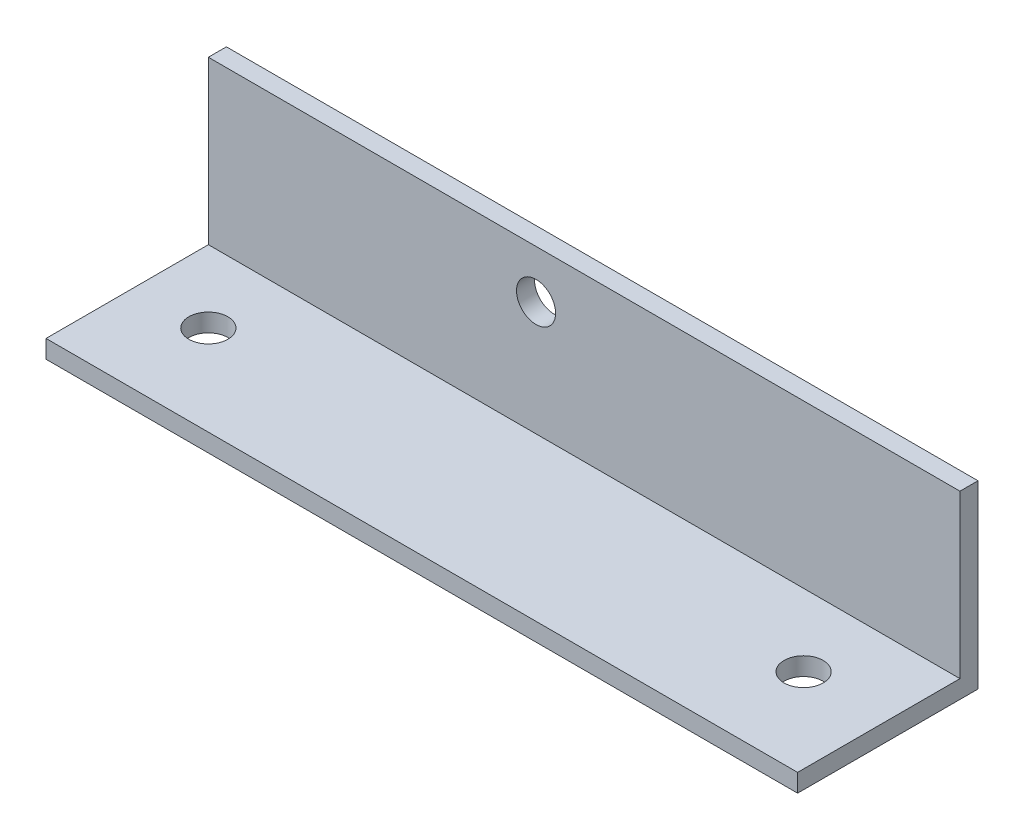
ISO-10303-21;
HEADER;
FILE_DESCRIPTION(('STEP AP214'),'2;1');
FILE_NAME('part.step','',(''),(''),'','','');
FILE_SCHEMA(('AUTOMOTIVE_DESIGN { 1 0 10303 214 1 1 1 1 }'));
ENDSEC;
DATA;
#1=APPLICATION_CONTEXT('core data for automotive mechanical design processes');
#2=APPLICATION_PROTOCOL_DEFINITION('international standard','automotive_design',2000,#1);
#3=PRODUCT_CONTEXT('',#1,'mechanical');
#4=PRODUCT('Part','Part','',(#3));
#5=PRODUCT_RELATED_PRODUCT_CATEGORY('part','',(#4));
#6=PRODUCT_DEFINITION_FORMATION('','',#4);
#7=PRODUCT_DEFINITION_CONTEXT('part definition',#1,'design');
#8=PRODUCT_DEFINITION('design','',#6,#7);
#9=PRODUCT_DEFINITION_SHAPE('','',#8);
#10=(LENGTH_UNIT() NAMED_UNIT(*) SI_UNIT(.MILLI.,.METRE.));
#11=(NAMED_UNIT(*) PLANE_ANGLE_UNIT() SI_UNIT($,.RADIAN.));
#12=(NAMED_UNIT(*) SI_UNIT($,.STERADIAN.) SOLID_ANGLE_UNIT());
#13=UNCERTAINTY_MEASURE_WITH_UNIT(LENGTH_MEASURE(1.E-05),#10,'distance_accuracy_value','');
#14=(GEOMETRIC_REPRESENTATION_CONTEXT(3) GLOBAL_UNCERTAINTY_ASSIGNED_CONTEXT((#13)) GLOBAL_UNIT_ASSIGNED_CONTEXT((#10,
#11,#12)) REPRESENTATION_CONTEXT('',''));
#15=CARTESIAN_POINT('',(0.,0.,0.));
#16=DIRECTION('',(0.,0.,1.));
#17=DIRECTION('',(1.,0.,0.));
#18=AXIS2_PLACEMENT_3D('',#15,#16,#17);
#19=CARTESIAN_POINT('',(0.,0.,3.));
#20=DIRECTION('',(0.,0.,-1.));
#21=DIRECTION('',(-1.,0.,0.));
#22=AXIS2_PLACEMENT_3D('',#19,#20,#21);
#23=PLANE('',#22);
#24=CARTESIAN_POINT('',(-8.00000292050326,7.00000000000041,3.));
#25=DIRECTION('',(0.,0.,-1.));
#26=DIRECTION('',(-1.,0.,0.));
#27=AXIS2_PLACEMENT_3D('',#24,#25,#26);
#28=CIRCLE('',#27,3.24999999999999);
#29=CARTESIAN_POINT('',(-11.2500029205033,7.00000000000041,3.));
#30=VERTEX_POINT('',#29);
#31=EDGE_CURVE('E155',#30,#30,#28,.T.);
#32=ORIENTED_EDGE('',*,*,#31,.T.);
#33=EDGE_LOOP('',(#32));
#34=FACE_BOUND('',#33,.T.);
#35=DIRECTION('',(-1.,0.,0.));
#36=VECTOR('',#35,1.);
#37=CARTESIAN_POINT('',(-62.5,-12.,3.));
#38=LINE('',#37,#36);
#39=CARTESIAN_POINT('',(62.5,-12.,3.));
#40=VERTEX_POINT('',#39);
#41=CARTESIAN_POINT('',(-62.5,-12.,3.));
#42=VERTEX_POINT('',#41);
#43=EDGE_CURVE('E48',#40,#42,#38,.T.);
#44=ORIENTED_EDGE('',*,*,#43,.F.);
#45=DIRECTION('',(0.,1.,0.));
#46=VECTOR('',#45,1.);
#47=CARTESIAN_POINT('',(62.5,-15.,3.));
#48=LINE('',#47,#46);
#49=CARTESIAN_POINT('',(62.5,15.,3.));
#50=VERTEX_POINT('',#49);
#51=EDGE_CURVE('E86',#40,#50,#48,.T.);
#52=ORIENTED_EDGE('',*,*,#51,.T.);
#53=DIRECTION('',(-1.,0.,0.));
#54=VECTOR('',#53,1.);
#55=CARTESIAN_POINT('',(-62.5,15.,3.));
#56=LINE('',#55,#54);
#57=CARTESIAN_POINT('',(-62.5,15.,3.));
#58=VERTEX_POINT('',#57);
#59=EDGE_CURVE('E54',#50,#58,#56,.T.);
#60=ORIENTED_EDGE('',*,*,#59,.T.);
#61=DIRECTION('',(0.,-1.,0.));
#62=VECTOR('',#61,1.);
#63=CARTESIAN_POINT('',(-62.5,-15.,3.));
#64=LINE('',#63,#62);
#65=EDGE_CURVE('E97',#58,#42,#64,.T.);
#66=ORIENTED_EDGE('',*,*,#65,.T.);
#67=EDGE_LOOP('',(#44,#52,#60,#66));
#68=FACE_BOUND('',#67,.T.);
#69=ADVANCED_FACE('F32',(#34,#68),#23,.F.);
#70=CARTESIAN_POINT('',(62.5,-15.,3.));
#71=DIRECTION('',(-1.,0.,0.));
#72=DIRECTION('',(0.,0.,1.));
#73=AXIS2_PLACEMENT_3D('',#70,#71,#72);
#74=PLANE('',#73);
#75=DIRECTION('',(0.,1.,0.));
#76=VECTOR('',#75,1.);
#77=CARTESIAN_POINT('',(62.5,-15.,0.));
#78=LINE('',#77,#76);
#79=CARTESIAN_POINT('',(62.5,-15.,0.));
#80=VERTEX_POINT('',#79);
#81=CARTESIAN_POINT('',(62.5,15.,0.));
#82=VERTEX_POINT('',#81);
#83=EDGE_CURVE('E93',#80,#82,#78,.T.);
#84=ORIENTED_EDGE('',*,*,#83,.T.);
#85=DIRECTION('',(0.,0.,-1.));
#86=VECTOR('',#85,1.);
#87=CARTESIAN_POINT('',(62.5,15.,3.));
#88=LINE('',#87,#86);
#89=EDGE_CURVE('E11',#50,#82,#88,.T.);
#90=ORIENTED_EDGE('',*,*,#89,.F.);
#91=ORIENTED_EDGE('',*,*,#51,.F.);
#92=DIRECTION('',(0.,0.,-1.));
#93=VECTOR('',#92,1.);
#94=CARTESIAN_POINT('',(62.5,-12.,30.));
#95=LINE('',#94,#93);
#96=CARTESIAN_POINT('',(62.5,-12.,30.));
#97=VERTEX_POINT('',#96);
#98=EDGE_CURVE('E101',#97,#40,#95,.T.);
#99=ORIENTED_EDGE('',*,*,#98,.F.);
#100=DIRECTION('',(0.,1.,0.));
#101=VECTOR('',#100,1.);
#102=CARTESIAN_POINT('',(62.5,-12.,30.));
#103=LINE('',#102,#101);
#104=CARTESIAN_POINT('',(62.5,-15.,30.));
#105=VERTEX_POINT('',#104);
#106=EDGE_CURVE('E96',#105,#97,#103,.T.);
#107=ORIENTED_EDGE('',*,*,#106,.F.);
#108=DIRECTION('',(0.,0.,-1.));
#109=VECTOR('',#108,1.);
#110=CARTESIAN_POINT('',(62.5,-15.,3.));
#111=LINE('',#110,#109);
#112=EDGE_CURVE('E79',#105,#80,#111,.T.);
#113=ORIENTED_EDGE('',*,*,#112,.T.);
#114=EDGE_LOOP('',(#84,#90,#91,#99,#107,#113));
#115=FACE_BOUND('',#114,.T.);
#116=ADVANCED_FACE('F34',(#115),#74,.F.);
#117=CARTESIAN_POINT('',(-62.5,15.,3.));
#118=DIRECTION('',(0.,-1.,0.));
#119=DIRECTION('',(0.,0.,-1.));
#120=AXIS2_PLACEMENT_3D('',#117,#118,#119);
#121=PLANE('',#120);
#122=DIRECTION('',(-1.,0.,0.));
#123=VECTOR('',#122,1.);
#124=CARTESIAN_POINT('',(-62.5,15.,0.));
#125=LINE('',#124,#123);
#126=CARTESIAN_POINT('',(-62.5,15.,0.));
#127=VERTEX_POINT('',#126);
#128=EDGE_CURVE('E100',#82,#127,#125,.T.);
#129=ORIENTED_EDGE('',*,*,#128,.T.);
#130=DIRECTION('',(0.,0.,-1.));
#131=VECTOR('',#130,1.);
#132=CARTESIAN_POINT('',(-62.5,15.,3.));
#133=LINE('',#132,#131);
#134=EDGE_CURVE('E41',#58,#127,#133,.T.);
#135=ORIENTED_EDGE('',*,*,#134,.F.);
#136=ORIENTED_EDGE('',*,*,#59,.F.);
#137=ORIENTED_EDGE('',*,*,#89,.T.);
#138=EDGE_LOOP('',(#129,#135,#136,#137));
#139=FACE_BOUND('',#138,.T.);
#140=ADVANCED_FACE('F118',(#139),#121,.F.);
#141=CARTESIAN_POINT('',(-62.5,-15.,3.));
#142=DIRECTION('',(1.,0.,0.));
#143=DIRECTION('',(0.,0.,-1.));
#144=AXIS2_PLACEMENT_3D('',#141,#142,#143);
#145=PLANE('',#144);
#146=DIRECTION('',(0.,-1.,0.));
#147=VECTOR('',#146,1.);
#148=CARTESIAN_POINT('',(-62.5,-15.,0.));
#149=LINE('',#148,#147);
#150=CARTESIAN_POINT('',(-62.5,-15.,0.));
#151=VERTEX_POINT('',#150);
#152=EDGE_CURVE('E87',#127,#151,#149,.T.);
#153=ORIENTED_EDGE('',*,*,#152,.T.);
#154=DIRECTION('',(0.,0.,-1.));
#155=VECTOR('',#154,1.);
#156=CARTESIAN_POINT('',(-62.5,-15.,3.));
#157=LINE('',#156,#155);
#158=CARTESIAN_POINT('',(-62.5,-15.,30.));
#159=VERTEX_POINT('',#158);
#160=EDGE_CURVE('E82',#159,#151,#157,.T.);
#161=ORIENTED_EDGE('',*,*,#160,.F.);
#162=DIRECTION('',(0.,-1.,0.));
#163=VECTOR('',#162,1.);
#164=CARTESIAN_POINT('',(-62.5,-15.,30.));
#165=LINE('',#164,#163);
#166=CARTESIAN_POINT('',(-62.5,-12.,30.));
#167=VERTEX_POINT('',#166);
#168=EDGE_CURVE('E138',#167,#159,#165,.T.);
#169=ORIENTED_EDGE('',*,*,#168,.F.);
#170=DIRECTION('',(0.,0.,-1.));
#171=VECTOR('',#170,1.);
#172=CARTESIAN_POINT('',(-62.5,-12.,30.));
#173=LINE('',#172,#171);
#174=EDGE_CURVE('E105',#167,#42,#173,.T.);
#175=ORIENTED_EDGE('',*,*,#174,.T.);
#176=ORIENTED_EDGE('',*,*,#65,.F.);
#177=ORIENTED_EDGE('',*,*,#134,.T.);
#178=EDGE_LOOP('',(#153,#161,#169,#175,#176,#177));
#179=FACE_BOUND('',#178,.T.);
#180=ADVANCED_FACE('F115',(#179),#145,.F.);
#181=CARTESIAN_POINT('',(-62.5,-15.,3.));
#182=DIRECTION('',(0.,1.,0.));
#183=DIRECTION('',(0.,0.,1.));
#184=AXIS2_PLACEMENT_3D('',#181,#182,#183);
#185=PLANE('',#184);
#186=CARTESIAN_POINT('',(48.5000000000011,-15.,15.0000000000051));
#187=DIRECTION('',(0.,1.,0.));
#188=DIRECTION('',(0.,0.,1.));
#189=AXIS2_PLACEMENT_3D('',#186,#187,#188);
#190=CIRCLE('',#189,3.25);
#191=CARTESIAN_POINT('',(48.5000000000011,-15.,18.2500000000051));
#192=VERTEX_POINT('',#191);
#193=EDGE_CURVE('E36',#192,#192,#190,.T.);
#194=ORIENTED_EDGE('',*,*,#193,.T.);
#195=EDGE_LOOP('',(#194));
#196=FACE_BOUND('',#195,.T.);
#197=CARTESIAN_POINT('',(-50.499999999999,-15.,15.0000000000034));
#198=DIRECTION('',(0.,1.,0.));
#199=DIRECTION('',(0.,0.,1.));
#200=AXIS2_PLACEMENT_3D('',#197,#198,#199);
#201=CIRCLE('',#200,3.25);
#202=CARTESIAN_POINT('',(-50.499999999999,-15.,18.2500000000034));
#203=VERTEX_POINT('',#202);
#204=EDGE_CURVE('E139',#203,#203,#201,.T.);
#205=ORIENTED_EDGE('',*,*,#204,.T.);
#206=EDGE_LOOP('',(#205));
#207=FACE_BOUND('',#206,.T.);
#208=DIRECTION('',(1.,0.,0.));
#209=VECTOR('',#208,1.);
#210=CARTESIAN_POINT('',(-62.5,-15.,0.));
#211=LINE('',#210,#209);
#212=EDGE_CURVE('E74',#151,#80,#211,.T.);
#213=ORIENTED_EDGE('',*,*,#212,.T.);
#214=ORIENTED_EDGE('',*,*,#112,.F.);
#215=DIRECTION('',(1.,0.,0.));
#216=VECTOR('',#215,1.);
#217=CARTESIAN_POINT('',(-62.5,-15.,30.));
#218=LINE('',#217,#216);
#219=EDGE_CURVE('E134',#159,#105,#218,.T.);
#220=ORIENTED_EDGE('',*,*,#219,.F.);
#221=ORIENTED_EDGE('',*,*,#160,.T.);
#222=EDGE_LOOP('',(#213,#214,#220,#221));
#223=FACE_BOUND('',#222,.T.);
#224=ADVANCED_FACE('F76',(#196,#207,#223),#185,.F.);
#225=CARTESIAN_POINT('',(0.,0.,0.));
#226=DIRECTION('',(0.,0.,-1.));
#227=DIRECTION('',(-1.,0.,0.));
#228=AXIS2_PLACEMENT_3D('',#225,#226,#227);
#229=PLANE('',#228);
#230=CARTESIAN_POINT('',(-8.00000292050326,7.00000000000041,0.));
#231=DIRECTION('',(0.,0.,-1.));
#232=DIRECTION('',(-1.,0.,0.));
#233=AXIS2_PLACEMENT_3D('',#230,#231,#232);
#234=CIRCLE('',#233,3.25);
#235=CARTESIAN_POINT('',(-11.2500029205033,7.00000000000041,0.));
#236=VERTEX_POINT('',#235);
#237=EDGE_CURVE('E158',#236,#236,#234,.T.);
#238=ORIENTED_EDGE('',*,*,#237,.F.);
#239=EDGE_LOOP('',(#238));
#240=FACE_BOUND('',#239,.T.);
#241=ORIENTED_EDGE('',*,*,#83,.F.);
#242=ORIENTED_EDGE('',*,*,#212,.F.);
#243=ORIENTED_EDGE('',*,*,#152,.F.);
#244=ORIENTED_EDGE('',*,*,#128,.F.);
#245=EDGE_LOOP('',(#241,#242,#243,#244));
#246=FACE_BOUND('',#245,.T.);
#247=ADVANCED_FACE('F99',(#240,#246),#229,.T.);
#248=CARTESIAN_POINT('',(-62.5,-12.,30.));
#249=DIRECTION('',(0.,-1.,0.));
#250=DIRECTION('',(0.,0.,-1.));
#251=AXIS2_PLACEMENT_3D('',#248,#249,#250);
#252=PLANE('',#251);
#253=CARTESIAN_POINT('',(48.5000000000011,-12.,15.0000000000051));
#254=DIRECTION('',(0.,1.,0.));
#255=DIRECTION('',(0.,0.,1.));
#256=AXIS2_PLACEMENT_3D('',#253,#254,#255);
#257=CIRCLE('',#256,3.25);
#258=CARTESIAN_POINT('',(48.5000000000011,-12.,18.2500000000051));
#259=VERTEX_POINT('',#258);
#260=EDGE_CURVE('E152',#259,#259,#257,.T.);
#261=ORIENTED_EDGE('',*,*,#260,.F.);
#262=EDGE_LOOP('',(#261));
#263=FACE_BOUND('',#262,.T.);
#264=CARTESIAN_POINT('',(-50.499999999999,-12.,15.0000000000034));
#265=DIRECTION('',(0.,1.,0.));
#266=DIRECTION('',(0.,0.,1.));
#267=AXIS2_PLACEMENT_3D('',#264,#265,#266);
#268=CIRCLE('',#267,3.25);
#269=CARTESIAN_POINT('',(-50.499999999999,-12.,18.2500000000034));
#270=VERTEX_POINT('',#269);
#271=EDGE_CURVE('E149',#270,#270,#268,.T.);
#272=ORIENTED_EDGE('',*,*,#271,.F.);
#273=EDGE_LOOP('',(#272));
#274=FACE_BOUND('',#273,.T.);
#275=ORIENTED_EDGE('',*,*,#43,.T.);
#276=ORIENTED_EDGE('',*,*,#174,.F.);
#277=DIRECTION('',(-1.,0.,0.));
#278=VECTOR('',#277,1.);
#279=CARTESIAN_POINT('',(-62.5,-12.,30.));
#280=LINE('',#279,#278);
#281=EDGE_CURVE('E127',#97,#167,#280,.T.);
#282=ORIENTED_EDGE('',*,*,#281,.F.);
#283=ORIENTED_EDGE('',*,*,#98,.T.);
#284=EDGE_LOOP('',(#275,#276,#282,#283));
#285=FACE_BOUND('',#284,.T.);
#286=ADVANCED_FACE('F123',(#263,#274,#285),#252,.F.);
#287=CARTESIAN_POINT('',(0.,0.,30.));
#288=DIRECTION('',(0.,0.,-1.));
#289=DIRECTION('',(-1.,0.,0.));
#290=AXIS2_PLACEMENT_3D('',#287,#288,#289);
#291=PLANE('',#290);
#292=ORIENTED_EDGE('',*,*,#168,.T.);
#293=ORIENTED_EDGE('',*,*,#219,.T.);
#294=ORIENTED_EDGE('',*,*,#106,.T.);
#295=ORIENTED_EDGE('',*,*,#281,.T.);
#296=EDGE_LOOP('',(#292,#293,#294,#295));
#297=FACE_BOUND('',#296,.T.);
#298=ADVANCED_FACE('F144',(#297),#291,.F.);
#299=CARTESIAN_POINT('',(-50.499999999999,-12.,15.0000000000034));
#300=DIRECTION('',(0.,1.,0.));
#301=DIRECTION('',(0.,0.,1.));
#302=AXIS2_PLACEMENT_3D('',#299,#300,#301);
#303=CYLINDRICAL_SURFACE('',#302,3.25);
#304=ORIENTED_EDGE('',*,*,#271,.T.);
#305=EDGE_LOOP('',(#304));
#306=FACE_BOUND('',#305,.T.);
#307=ORIENTED_EDGE('',*,*,#204,.F.);
#308=EDGE_LOOP('',(#307));
#309=FACE_BOUND('',#308,.T.);
#310=ADVANCED_FACE('F184',(#306,#309),#303,.F.);
#311=CARTESIAN_POINT('',(48.5000000000011,-12.,15.0000000000051));
#312=DIRECTION('',(0.,1.,0.));
#313=DIRECTION('',(0.,0.,1.));
#314=AXIS2_PLACEMENT_3D('',#311,#312,#313);
#315=CYLINDRICAL_SURFACE('',#314,3.25);
#316=ORIENTED_EDGE('',*,*,#260,.T.);
#317=EDGE_LOOP('',(#316));
#318=FACE_BOUND('',#317,.T.);
#319=ORIENTED_EDGE('',*,*,#193,.F.);
#320=EDGE_LOOP('',(#319));
#321=FACE_BOUND('',#320,.T.);
#322=ADVANCED_FACE('F187',(#318,#321),#315,.F.);
#323=CARTESIAN_POINT('',(-8.00000292050326,7.00000000000041,0.));
#324=DIRECTION('',(0.,0.,-1.));
#325=DIRECTION('',(-1.,0.,0.));
#326=AXIS2_PLACEMENT_3D('',#323,#324,#325);
#327=CYLINDRICAL_SURFACE('',#326,3.24999999999999);
#328=ORIENTED_EDGE('',*,*,#237,.T.);
#329=EDGE_LOOP('',(#328));
#330=FACE_BOUND('',#329,.T.);
#331=ORIENTED_EDGE('',*,*,#31,.F.);
#332=EDGE_LOOP('',(#331));
#333=FACE_BOUND('',#332,.T.);
#334=ADVANCED_FACE('F162',(#330,#333),#327,.F.);
#335=CLOSED_SHELL('',(#69,#116,#140,#180,#224,#247,#286,#298,#310,#322,#334));
#336=MANIFOLD_SOLID_BREP('B2',#335);
#337=ADVANCED_BREP_SHAPE_REPRESENTATION('',(#18,#336),#14);
#338=SHAPE_DEFINITION_REPRESENTATION(#9,#337);
ENDSEC;
END-ISO-10303-21;
